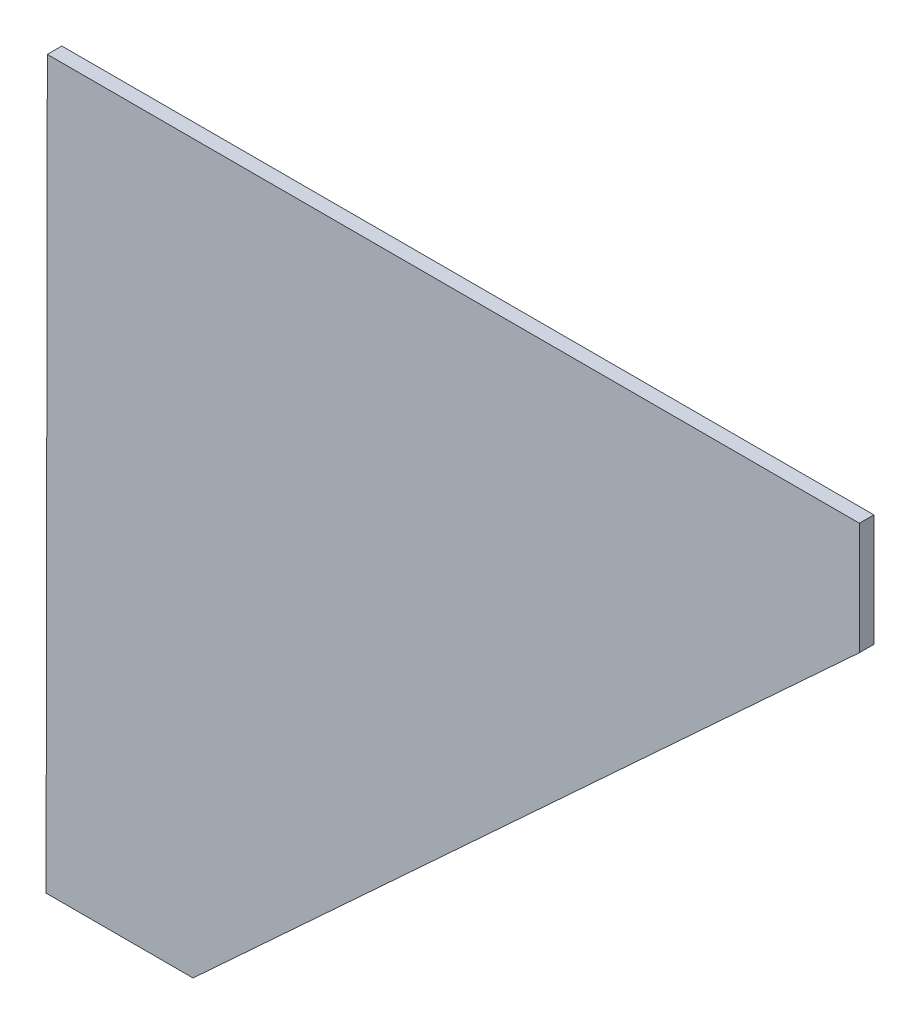
ISO-10303-21;
HEADER;
FILE_DESCRIPTION(('STEP AP214'),'2;1');
FILE_NAME('part.step','',(''),(''),'','','');
FILE_SCHEMA(('AUTOMOTIVE_DESIGN { 1 0 10303 214 1 1 1 1 }'));
ENDSEC;
DATA;
#1=APPLICATION_CONTEXT('core data for automotive mechanical design processes');
#2=APPLICATION_PROTOCOL_DEFINITION('international standard','automotive_design',2000,#1);
#3=PRODUCT_CONTEXT('',#1,'mechanical');
#4=PRODUCT('Part','Part','',(#3));
#5=PRODUCT_RELATED_PRODUCT_CATEGORY('part','',(#4));
#6=PRODUCT_DEFINITION_FORMATION('','',#4);
#7=PRODUCT_DEFINITION_CONTEXT('part definition',#1,'design');
#8=PRODUCT_DEFINITION('design','',#6,#7);
#9=PRODUCT_DEFINITION_SHAPE('','',#8);
#10=(LENGTH_UNIT() NAMED_UNIT(*) SI_UNIT(.MILLI.,.METRE.));
#11=(NAMED_UNIT(*) PLANE_ANGLE_UNIT() SI_UNIT($,.RADIAN.));
#12=(NAMED_UNIT(*) SI_UNIT($,.STERADIAN.) SOLID_ANGLE_UNIT());
#13=UNCERTAINTY_MEASURE_WITH_UNIT(LENGTH_MEASURE(1.E-05),#10,'distance_accuracy_value','');
#14=(GEOMETRIC_REPRESENTATION_CONTEXT(3) GLOBAL_UNCERTAINTY_ASSIGNED_CONTEXT((#13)) GLOBAL_UNIT_ASSIGNED_CONTEXT((#10,
#11,#12)) REPRESENTATION_CONTEXT('',''));
#15=CARTESIAN_POINT('',(0.,0.,0.));
#16=DIRECTION('',(0.,0.,1.));
#17=DIRECTION('',(1.,0.,0.));
#18=AXIS2_PLACEMENT_3D('',#15,#16,#17);
#19=CARTESIAN_POINT('',(-2090.0928,-463.229720641288,9.525));
#20=DIRECTION('',(0.,1.,0.));
#21=DIRECTION('',(-1.,0.,0.));
#22=AXIS2_PLACEMENT_3D('',#19,#20,#21);
#23=PLANE('',#22);
#24=DIRECTION('',(1.,0.,0.));
#25=VECTOR('',#24,1.);
#26=CARTESIAN_POINT('',(-2090.0928,-463.229720641288,0.));
#27=LINE('',#26,#25);
#28=CARTESIAN_POINT('',(-2090.0928,-463.229720641288,0.));
#29=VERTEX_POINT('',#28);
#30=CARTESIAN_POINT('',(-1993.5728,-463.229720641288,0.));
#31=VERTEX_POINT('',#30);
#32=EDGE_CURVE('E109',#29,#31,#27,.T.);
#33=ORIENTED_EDGE('',*,*,#32,.T.);
#34=DIRECTION('',(0.,0.,-1.));
#35=VECTOR('',#34,1.);
#36=CARTESIAN_POINT('',(-1993.5728,-463.229720641288,9.525));
#37=LINE('',#36,#35);
#38=CARTESIAN_POINT('',(-1993.5728,-463.229720641288,9.525));
#39=VERTEX_POINT('',#38);
#40=EDGE_CURVE('E11',#39,#31,#37,.T.);
#41=ORIENTED_EDGE('',*,*,#40,.F.);
#42=DIRECTION('',(1.,0.,0.));
#43=VECTOR('',#42,1.);
#44=CARTESIAN_POINT('',(-2090.0928,-463.229720641288,9.525));
#45=LINE('',#44,#43);
#46=CARTESIAN_POINT('',(-2090.0928,-463.229720641288,9.525));
#47=VERTEX_POINT('',#46);
#48=EDGE_CURVE('E117',#47,#39,#45,.T.);
#49=ORIENTED_EDGE('',*,*,#48,.F.);
#50=DIRECTION('',(0.,0.,-1.));
#51=VECTOR('',#50,1.);
#52=CARTESIAN_POINT('',(-2090.0928,-463.229720641288,9.525));
#53=LINE('',#52,#51);
#54=EDGE_CURVE('E105',#47,#29,#53,.T.);
#55=ORIENTED_EDGE('',*,*,#54,.T.);
#56=EDGE_LOOP('',(#33,#41,#49,#55));
#57=FACE_BOUND('',#56,.T.);
#58=ADVANCED_FACE('F35',(#57),#23,.F.);
#59=CARTESIAN_POINT('',(-1993.5728,-463.229720641288,9.525));
#60=DIRECTION('',(-0.678129584875215,0.734942355642243,0.));
#61=DIRECTION('',(-0.734942355642243,-0.678129584875215,0.));
#62=AXIS2_PLACEMENT_3D('',#59,#60,#61);
#63=PLANE('',#62);
#64=DIRECTION('',(0.734942355642243,0.678129584875215,0.));
#65=VECTOR('',#64,1.);
#66=CARTESIAN_POINT('',(-1993.5728,-463.229720641288,0.));
#67=LINE('',#66,#65);
#68=CARTESIAN_POINT('',(-1555.87796059214,-59.3697206412883,0.));
#69=VERTEX_POINT('',#68);
#70=EDGE_CURVE('E112',#31,#69,#67,.T.);
#71=ORIENTED_EDGE('',*,*,#70,.T.);
#72=DIRECTION('',(0.,0.,-1.));
#73=VECTOR('',#72,1.);
#74=CARTESIAN_POINT('',(-1555.87796059214,-59.3697206412883,9.525));
#75=LINE('',#74,#73);
#76=CARTESIAN_POINT('',(-1555.87796059214,-59.3697206412883,9.525));
#77=VERTEX_POINT('',#76);
#78=EDGE_CURVE('E43',#77,#69,#75,.T.);
#79=ORIENTED_EDGE('',*,*,#78,.F.);
#80=DIRECTION('',(0.734942355642243,0.678129584875215,0.));
#81=VECTOR('',#80,1.);
#82=CARTESIAN_POINT('',(-1993.5728,-463.229720641288,9.525));
#83=LINE('',#82,#81);
#84=EDGE_CURVE('E85',#39,#77,#83,.T.);
#85=ORIENTED_EDGE('',*,*,#84,.F.);
#86=ORIENTED_EDGE('',*,*,#40,.T.);
#87=EDGE_LOOP('',(#71,#79,#85,#86));
#88=FACE_BOUND('',#87,.T.);
#89=ADVANCED_FACE('F136',(#88),#63,.F.);
#90=CARTESIAN_POINT('',(-1555.87796059214,-59.3697206412883,9.525));
#91=DIRECTION('',(-1.,0.,0.));
#92=DIRECTION('',(0.,0.,1.));
#93=AXIS2_PLACEMENT_3D('',#90,#91,#92);
#94=PLANE('',#93);
#95=DIRECTION('',(0.,1.,0.));
#96=VECTOR('',#95,1.);
#97=CARTESIAN_POINT('',(-1555.87796059214,-59.3697206412883,0.));
#98=LINE('',#97,#96);
#99=CARTESIAN_POINT('',(-1555.87796059214,14.2902793587117,0.));
#100=VERTEX_POINT('',#99);
#101=EDGE_CURVE('E100',#69,#100,#98,.T.);
#102=ORIENTED_EDGE('',*,*,#101,.T.);
#103=DIRECTION('',(0.,0.,-1.));
#104=VECTOR('',#103,1.);
#105=CARTESIAN_POINT('',(-1555.87796059214,14.2902793587117,9.525));
#106=LINE('',#105,#104);
#107=CARTESIAN_POINT('',(-1555.87796059214,14.2902793587117,9.525));
#108=VERTEX_POINT('',#107);
#109=EDGE_CURVE('E97',#108,#100,#106,.T.);
#110=ORIENTED_EDGE('',*,*,#109,.F.);
#111=DIRECTION('',(0.,1.,0.));
#112=VECTOR('',#111,1.);
#113=CARTESIAN_POINT('',(-1555.87796059214,-59.3697206412883,9.525));
#114=LINE('',#113,#112);
#115=EDGE_CURVE('E89',#77,#108,#114,.T.);
#116=ORIENTED_EDGE('',*,*,#115,.F.);
#117=ORIENTED_EDGE('',*,*,#78,.T.);
#118=EDGE_LOOP('',(#102,#110,#116,#117));
#119=FACE_BOUND('',#118,.T.);
#120=ADVANCED_FACE('F98',(#119),#94,.F.);
#121=CARTESIAN_POINT('',(-1555.87796059214,14.2902793587117,9.525));
#122=DIRECTION('',(0.,-1.,0.));
#123=DIRECTION('',(1.,0.,0.));
#124=AXIS2_PLACEMENT_3D('',#121,#122,#123);
#125=PLANE('',#124);
#126=DIRECTION('',(-1.,0.,0.));
#127=VECTOR('',#126,1.);
#128=CARTESIAN_POINT('',(-1555.87796059214,14.2902793587117,0.));
#129=LINE('',#128,#127);
#130=CARTESIAN_POINT('',(-2089.27796059214,14.2902793587117,0.));
#131=VERTEX_POINT('',#130);
#132=EDGE_CURVE('E71',#100,#131,#129,.T.);
#133=ORIENTED_EDGE('',*,*,#132,.T.);
#134=DIRECTION('',(0.,0.,-1.));
#135=VECTOR('',#134,1.);
#136=CARTESIAN_POINT('',(-2089.27796059214,14.2902793587117,9.525));
#137=LINE('',#136,#135);
#138=CARTESIAN_POINT('',(-2089.27796059214,14.2902793587117,9.525));
#139=VERTEX_POINT('',#138);
#140=EDGE_CURVE('E101',#139,#131,#137,.T.);
#141=ORIENTED_EDGE('',*,*,#140,.F.);
#142=DIRECTION('',(-1.,0.,0.));
#143=VECTOR('',#142,1.);
#144=CARTESIAN_POINT('',(-1555.87796059214,14.2902793587117,9.525));
#145=LINE('',#144,#143);
#146=EDGE_CURVE('E93',#108,#139,#145,.T.);
#147=ORIENTED_EDGE('',*,*,#146,.F.);
#148=ORIENTED_EDGE('',*,*,#109,.T.);
#149=EDGE_LOOP('',(#133,#141,#147,#148));
#150=FACE_BOUND('',#149,.T.);
#151=ADVANCED_FACE('F103',(#150),#125,.F.);
#152=CARTESIAN_POINT('',(-2089.27796059214,14.2902793587117,9.525));
#153=DIRECTION('',(0.999998544105273,-0.00170639600758135,0.));
#154=DIRECTION('',(0.00170639600758135,0.999998544105273,0.));
#155=AXIS2_PLACEMENT_3D('',#152,#153,#154);
#156=PLANE('',#155);
#157=DIRECTION('',(-0.00170639600758135,-0.999998544105273,0.));
#158=VECTOR('',#157,1.);
#159=CARTESIAN_POINT('',(-2089.27796059214,14.2902793587117,0.));
#160=LINE('',#159,#158);
#161=EDGE_CURVE('E77',#131,#29,#160,.T.);
#162=ORIENTED_EDGE('',*,*,#161,.T.);
#163=ORIENTED_EDGE('',*,*,#54,.F.);
#164=DIRECTION('',(-0.00170639600758135,-0.999998544105273,0.));
#165=VECTOR('',#164,1.);
#166=CARTESIAN_POINT('',(-2089.27796059214,14.2902793587117,9.525));
#167=LINE('',#166,#165);
#168=EDGE_CURVE('E51',#139,#47,#167,.T.);
#169=ORIENTED_EDGE('',*,*,#168,.F.);
#170=ORIENTED_EDGE('',*,*,#140,.T.);
#171=EDGE_LOOP('',(#162,#163,#169,#170));
#172=FACE_BOUND('',#171,.T.);
#173=ADVANCED_FACE('F125',(#172),#156,.F.);
#174=CARTESIAN_POINT('',(0.,0.,9.525));
#175=DIRECTION('',(0.,0.,1.));
#176=DIRECTION('',(1.,0.,0.));
#177=AXIS2_PLACEMENT_3D('',#174,#175,#176);
#178=PLANE('',#177);
#179=ORIENTED_EDGE('',*,*,#48,.T.);
#180=ORIENTED_EDGE('',*,*,#84,.T.);
#181=ORIENTED_EDGE('',*,*,#115,.T.);
#182=ORIENTED_EDGE('',*,*,#146,.T.);
#183=ORIENTED_EDGE('',*,*,#168,.T.);
#184=EDGE_LOOP('',(#179,#180,#181,#182,#183));
#185=FACE_BOUND('',#184,.T.);
#186=ADVANCED_FACE('F91',(#185),#178,.T.);
#187=CARTESIAN_POINT('',(0.,0.,0.));
#188=DIRECTION('',(0.,0.,1.));
#189=DIRECTION('',(1.,0.,0.));
#190=AXIS2_PLACEMENT_3D('',#187,#188,#189);
#191=PLANE('',#190);
#192=ORIENTED_EDGE('',*,*,#32,.F.);
#193=ORIENTED_EDGE('',*,*,#161,.F.);
#194=ORIENTED_EDGE('',*,*,#132,.F.);
#195=ORIENTED_EDGE('',*,*,#101,.F.);
#196=ORIENTED_EDGE('',*,*,#70,.F.);
#197=EDGE_LOOP('',(#192,#193,#194,#195,#196));
#198=FACE_BOUND('',#197,.T.);
#199=ADVANCED_FACE('F121',(#198),#191,.F.);
#200=CLOSED_SHELL('',(#58,#89,#120,#151,#173,#186,#199));
#201=MANIFOLD_SOLID_BREP('B2',#200);
#202=ADVANCED_BREP_SHAPE_REPRESENTATION('',(#18,#201),#14);
#203=SHAPE_DEFINITION_REPRESENTATION(#9,#202);
ENDSEC;
END-ISO-10303-21;
